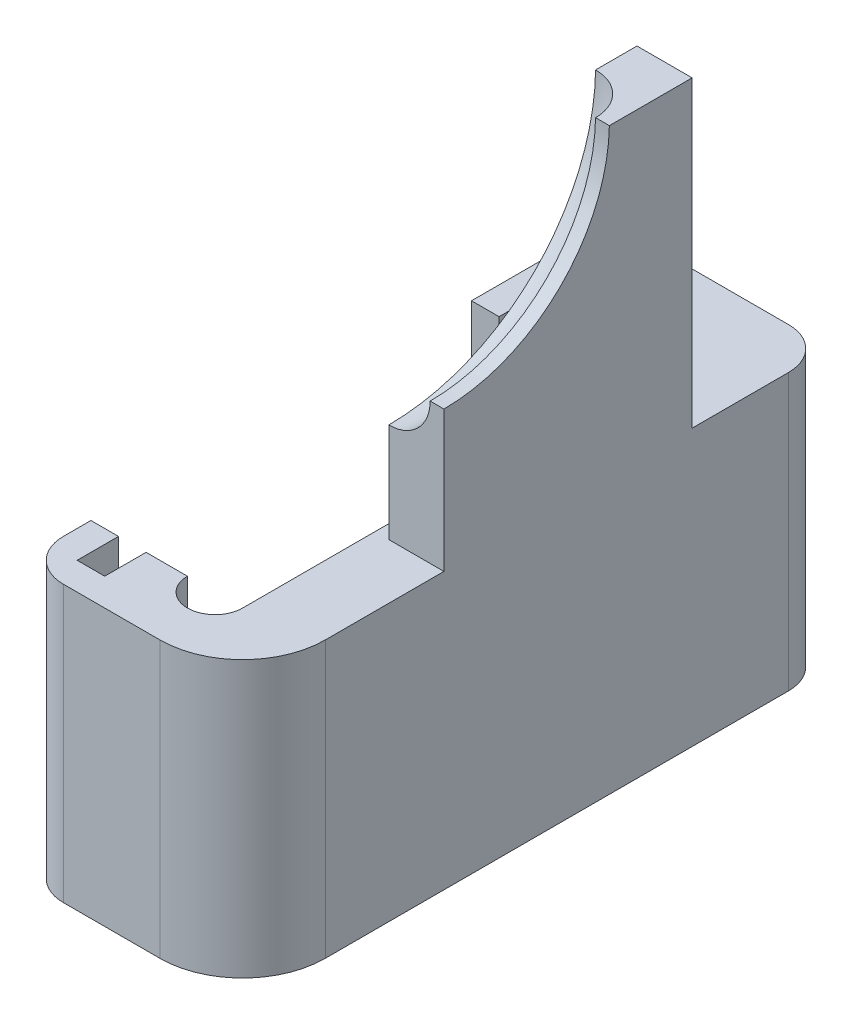
ISO-10303-21;
HEADER;
FILE_DESCRIPTION(('STEP AP214'),'2;1');
FILE_NAME('part.step','',(''),(''),'','','');
FILE_SCHEMA(('AUTOMOTIVE_DESIGN { 1 0 10303 214 1 1 1 1 }'));
ENDSEC;
DATA;
#1=APPLICATION_CONTEXT('core data for automotive mechanical design processes');
#2=APPLICATION_PROTOCOL_DEFINITION('international standard','automotive_design',2000,#1);
#3=PRODUCT_CONTEXT('',#1,'mechanical');
#4=PRODUCT('Part','Part','',(#3));
#5=PRODUCT_RELATED_PRODUCT_CATEGORY('part','',(#4));
#6=PRODUCT_DEFINITION_FORMATION('','',#4);
#7=PRODUCT_DEFINITION_CONTEXT('part definition',#1,'design');
#8=PRODUCT_DEFINITION('design','',#6,#7);
#9=PRODUCT_DEFINITION_SHAPE('','',#8);
#10=(LENGTH_UNIT() NAMED_UNIT(*) SI_UNIT(.MILLI.,.METRE.));
#11=(NAMED_UNIT(*) PLANE_ANGLE_UNIT() SI_UNIT($,.RADIAN.));
#12=(NAMED_UNIT(*) SI_UNIT($,.STERADIAN.) SOLID_ANGLE_UNIT());
#13=UNCERTAINTY_MEASURE_WITH_UNIT(LENGTH_MEASURE(1.E-05),#10,'distance_accuracy_value','');
#14=(GEOMETRIC_REPRESENTATION_CONTEXT(3) GLOBAL_UNCERTAINTY_ASSIGNED_CONTEXT((#13)) GLOBAL_UNIT_ASSIGNED_CONTEXT((#10,
#11,#12)) REPRESENTATION_CONTEXT('',''));
#15=CARTESIAN_POINT('',(0.,0.,0.));
#16=DIRECTION('',(0.,0.,1.));
#17=DIRECTION('',(1.,0.,0.));
#18=AXIS2_PLACEMENT_3D('',#15,#16,#17);
#19=CARTESIAN_POINT('',(0.,20.,0.));
#20=DIRECTION('',(1.,0.,0.));
#21=DIRECTION('',(0.,0.,-1.));
#22=AXIS2_PLACEMENT_3D('',#19,#20,#21);
#23=PLANE('',#22);
#24=DIRECTION('',(0.,0.,1.));
#25=VECTOR('',#24,1.);
#26=CARTESIAN_POINT('',(0.,20.,0.));
#27=LINE('',#26,#25);
#28=CARTESIAN_POINT('',(0.,20.,-15.3));
#29=VERTEX_POINT('',#28);
#30=CARTESIAN_POINT('',(0.,20.,12.3));
#31=VERTEX_POINT('',#30);
#32=EDGE_CURVE('E325',#29,#31,#27,.T.);
#33=ORIENTED_EDGE('',*,*,#32,.F.);
#34=DIRECTION('',(0.,-1.,0.));
#35=VECTOR('',#34,1.);
#36=CARTESIAN_POINT('',(0.,20.,-15.3));
#37=LINE('',#36,#35);
#38=CARTESIAN_POINT('',(0.,0.,-15.3));
#39=VERTEX_POINT('',#38);
#40=EDGE_CURVE('E349',#29,#39,#37,.T.);
#41=ORIENTED_EDGE('',*,*,#40,.T.);
#42=DIRECTION('',(0.,0.,1.));
#43=VECTOR('',#42,1.);
#44=CARTESIAN_POINT('',(0.,0.,0.));
#45=LINE('',#44,#43);
#46=CARTESIAN_POINT('',(0.,0.,12.3));
#47=VERTEX_POINT('',#46);
#48=EDGE_CURVE('E324',#39,#47,#45,.T.);
#49=ORIENTED_EDGE('',*,*,#48,.T.);
#50=DIRECTION('',(0.,-1.,0.));
#51=VECTOR('',#50,1.);
#52=CARTESIAN_POINT('',(0.,20.,12.3));
#53=LINE('',#52,#51);
#54=EDGE_CURVE('E383',#31,#47,#53,.T.);
#55=ORIENTED_EDGE('',*,*,#54,.F.);
#56=EDGE_LOOP('',(#33,#41,#49,#55));
#57=FACE_BOUND('',#56,.T.);
#58=ADVANCED_FACE('F41',(#57),#23,.F.);
#59=CARTESIAN_POINT('',(5.,42.,-15.3));
#60=DIRECTION('',(0.,-1.,0.));
#61=DIRECTION('',(0.,0.,-1.));
#62=AXIS2_PLACEMENT_3D('',#59,#60,#61);
#63=PLANE('',#62);
#64=DIRECTION('',(-1.,0.,0.));
#65=VECTOR('',#64,1.);
#66=CARTESIAN_POINT('',(5.,42.,-15.3));
#67=LINE('',#66,#65);
#68=CARTESIAN_POINT('',(5.,42.,-15.3));
#69=VERTEX_POINT('',#68);
#70=CARTESIAN_POINT('',(0.999999999999998,42.,-15.3));
#71=VERTEX_POINT('',#70);
#72=EDGE_CURVE('E249',#69,#71,#67,.T.);
#73=ORIENTED_EDGE('',*,*,#72,.T.);
#74=DIRECTION('',(0.,0.,1.));
#75=VECTOR('',#74,1.);
#76=CARTESIAN_POINT('',(0.999999999999998,42.,-15.3));
#77=LINE('',#76,#75);
#78=CARTESIAN_POINT('',(0.999999999999999,42.,-12.2986666074021));
#79=VERTEX_POINT('',#78);
#80=EDGE_CURVE('E241',#71,#79,#77,.T.);
#81=ORIENTED_EDGE('',*,*,#80,.T.);
#82=CARTESIAN_POINT('',(0.999999999999997,42.,-12.2986666074021));
#83=CARTESIAN_POINT('',(1.08437406161409,42.,-12.298674696237));
#84=CARTESIAN_POINT('',(1.1687442891838,42.,-12.2951068290857));
#85=CARTESIAN_POINT('',(1.33688105471364,42.,-12.2808817787849));
#86=CARTESIAN_POINT('',(1.42064762152304,42.,-12.270224936723));
#87=CARTESIAN_POINT('',(1.58692627032326,42.,-12.2418952560513));
#88=CARTESIAN_POINT('',(1.66943925458114,42.,-12.2242277385516));
#89=CARTESIAN_POINT('',(1.83266347257536,42.,-12.1820200727732));
#90=CARTESIAN_POINT('',(1.91337472824478,42.,-12.1574800082056));
#91=CARTESIAN_POINT('',(2.15202702606067,42.,-12.0737493886059));
#92=CARTESIAN_POINT('',(2.30655440963789,42.,-12.0044367926932));
#93=CARTESIAN_POINT('',(2.6016662265804,42.,-11.8408991894104));
#94=CARTESIAN_POINT('',(2.74225310214225,42.,-11.7466785562464));
#95=CARTESIAN_POINT('',(3.00564252906627,42.,-11.535965002824));
#96=CARTESIAN_POINT('',(3.12844464421391,42.,-11.4194715364326));
#97=CARTESIAN_POINT('',(3.35276870084162,42.,-11.1674980723235));
#98=CARTESIAN_POINT('',(3.45428647550261,42.,-11.0320143655469));
#99=CARTESIAN_POINT('',(3.63316182097115,42.,-10.7459021486977));
#100=CARTESIAN_POINT('',(3.71051259426008,42.,-10.5952693933312));
#101=CARTESIAN_POINT('',(3.83878988138071,42.,-10.2831864255121));
#102=CARTESIAN_POINT('',(3.88973181912892,42.,-10.1217425895643));
#103=CARTESIAN_POINT('',(3.9510993685279,42.,-9.8491494929645));
#104=CARTESIAN_POINT('',(3.96942610120558,42.,-9.73971364487767));
#105=CARTESIAN_POINT('',(3.99387482206519,42.,-9.51964486876867));
#106=CARTESIAN_POINT('',(4.00001411802277,42.,-9.40901386300275));
#107=CARTESIAN_POINT('',(4.,42.,-9.29833321757652));
#108=B_SPLINE_CURVE_WITH_KNOTS('',3,(#82,#83,#84,#85,#86,#87,#88,#89,#90,#91,#92,#93,#94,#95,
#96,#97,#98,#99,#100,#101,#102,#103,#104,#105,#106,#107),.UNSPECIFIED.,.F.,.F.,(4,2,2,2,2,2,2,2,
2,2,2,2,4),(0.,0.253039861257311,0.50606754832943,0.758903553333104,1.01173647879609,
1.51719853519627,2.02257188416038,2.52795762653786,3.03344221570318,3.53906885616965,
4.04439985489145,4.37664716212887,4.70842229564323),.UNSPECIFIED.);
#109=CARTESIAN_POINT('',(4.,42.,-9.29833321757652));
#110=VERTEX_POINT('',#109);
#111=EDGE_CURVE('E50',#79,#110,#108,.T.);
#112=ORIENTED_EDGE('',*,*,#111,.T.);
#113=DIRECTION('',(1.,0.,0.));
#114=VECTOR('',#113,1.);
#115=CARTESIAN_POINT('',(-98.1609010757338,42.,-9.2983332175765));
#116=LINE('',#115,#114);
#117=CARTESIAN_POINT('',(5.,42.,-9.29833321757652));
#118=VERTEX_POINT('',#117);
#119=EDGE_CURVE('E604',#110,#118,#116,.T.);
#120=ORIENTED_EDGE('',*,*,#119,.T.);
#121=DIRECTION('',(0.,0.,1.));
#122=VECTOR('',#121,1.);
#123=CARTESIAN_POINT('',(5.,42.,-15.3));
#124=LINE('',#123,#122);
#125=EDGE_CURVE('E595',#69,#118,#124,.T.);
#126=ORIENTED_EDGE('',*,*,#125,.F.);
#127=EDGE_LOOP('',(#73,#81,#112,#120,#126));
#128=FACE_BOUND('',#127,.T.);
#129=ADVANCED_FACE('F431',(#128),#63,.F.);
#130=CARTESIAN_POINT('',(5.,20.,2.7));
#131=DIRECTION('',(0.,0.,1.));
#132=DIRECTION('',(0.,-1.,0.));
#133=AXIS2_PLACEMENT_3D('',#130,#131,#132);
#134=PLANE('',#133);
#135=DIRECTION('',(0.,-1.,0.));
#136=VECTOR('',#135,1.);
#137=CARTESIAN_POINT('',(1.,42.,2.7));
#138=LINE('',#137,#136);
#139=CARTESIAN_POINT('',(0.999999999999999,27.2,2.7));
#140=VERTEX_POINT('',#139);
#141=CARTESIAN_POINT('',(1.,20.,2.7));
#142=VERTEX_POINT('',#141);
#143=EDGE_CURVE('E57',#140,#142,#138,.T.);
#144=ORIENTED_EDGE('',*,*,#143,.T.);
#145=DIRECTION('',(-1.,0.,0.));
#146=VECTOR('',#145,1.);
#147=CARTESIAN_POINT('',(5.,20.,2.7));
#148=LINE('',#147,#146);
#149=CARTESIAN_POINT('',(5.,20.,2.7));
#150=VERTEX_POINT('',#149);
#151=EDGE_CURVE('E235',#150,#142,#148,.T.);
#152=ORIENTED_EDGE('',*,*,#151,.F.);
#153=DIRECTION('',(0.,1.,0.));
#154=VECTOR('',#153,1.);
#155=CARTESIAN_POINT('',(5.,20.,2.7));
#156=LINE('',#155,#154);
#157=CARTESIAN_POINT('',(5.,30.2,2.7));
#158=VERTEX_POINT('',#157);
#159=EDGE_CURVE('E592',#150,#158,#156,.T.);
#160=ORIENTED_EDGE('',*,*,#159,.T.);
#161=DIRECTION('',(1.,0.,0.));
#162=VECTOR('',#161,1.);
#163=CARTESIAN_POINT('',(-98.1609010757338,30.2,2.70000000000001));
#164=LINE('',#163,#162);
#165=CARTESIAN_POINT('',(4.,30.2,2.7));
#166=VERTEX_POINT('',#165);
#167=EDGE_CURVE('E605',#166,#158,#164,.T.);
#168=ORIENTED_EDGE('',*,*,#167,.F.);
#169=CARTESIAN_POINT('',(0.999999999999999,30.2,2.7));
#170=DIRECTION('',(0.,0.,1.));
#171=DIRECTION('',(0.,-1.,0.));
#172=AXIS2_PLACEMENT_3D('',#169,#170,#171);
#173=CIRCLE('',#172,3.);
#174=EDGE_CURVE('E11',#166,#140,#173,.F.);
#175=ORIENTED_EDGE('',*,*,#174,.T.);
#176=EDGE_LOOP('',(#144,#152,#160,#168,#175));
#177=FACE_BOUND('',#176,.T.);
#178=ADVANCED_FACE('F436',(#177),#134,.T.);
#179=CARTESIAN_POINT('',(-11.,20.,-22.3));
#180=DIRECTION('',(0.,0.,-1.));
#181=DIRECTION('',(-1.,0.,0.));
#182=AXIS2_PLACEMENT_3D('',#179,#180,#181);
#183=PLANE('',#182);
#184=DIRECTION('',(0.,1.,0.));
#185=VECTOR('',#184,1.);
#186=CARTESIAN_POINT('',(-8.99999999999999,20.,-22.3));
#187=LINE('',#186,#185);
#188=CARTESIAN_POINT('',(-8.99999999999999,0.,-22.3));
#189=VERTEX_POINT('',#188);
#190=CARTESIAN_POINT('',(-8.99999999999999,20.,-22.3));
#191=VERTEX_POINT('',#190);
#192=EDGE_CURVE('E251',#189,#191,#187,.T.);
#193=ORIENTED_EDGE('',*,*,#192,.F.);
#194=DIRECTION('',(1.,0.,0.));
#195=VECTOR('',#194,1.);
#196=CARTESIAN_POINT('',(-11.,0.,-22.3));
#197=LINE('',#196,#195);
#198=CARTESIAN_POINT('',(-7.00000000000001,0.,-22.3));
#199=VERTEX_POINT('',#198);
#200=EDGE_CURVE('E289',#189,#199,#197,.T.);
#201=ORIENTED_EDGE('',*,*,#200,.T.);
#202=DIRECTION('',(0.,1.,0.));
#203=VECTOR('',#202,1.);
#204=CARTESIAN_POINT('',(-7.00000000000001,20.,-22.3));
#205=LINE('',#204,#203);
#206=CARTESIAN_POINT('',(-7.00000000000001,20.,-22.3));
#207=VERTEX_POINT('',#206);
#208=EDGE_CURVE('E294',#199,#207,#205,.T.);
#209=ORIENTED_EDGE('',*,*,#208,.T.);
#210=DIRECTION('',(1.,0.,0.));
#211=VECTOR('',#210,1.);
#212=CARTESIAN_POINT('',(-11.,20.,-22.3));
#213=LINE('',#212,#211);
#214=EDGE_CURVE('E291',#191,#207,#213,.T.);
#215=ORIENTED_EDGE('',*,*,#214,.F.);
#216=EDGE_LOOP('',(#193,#201,#209,#215));
#217=FACE_BOUND('',#216,.T.);
#218=ADVANCED_FACE('F461',(#217),#183,.F.);
#219=CARTESIAN_POINT('',(-11.,20.,15.3));
#220=DIRECTION('',(0.,0.,1.));
#221=DIRECTION('',(1.,0.,0.));
#222=AXIS2_PLACEMENT_3D('',#219,#220,#221);
#223=PLANE('',#222);
#224=DIRECTION('',(0.,-1.,0.));
#225=VECTOR('',#224,1.);
#226=CARTESIAN_POINT('',(-8.99999999999999,20.,15.3));
#227=LINE('',#226,#225);
#228=CARTESIAN_POINT('',(-8.99999999999999,20.,15.3));
#229=VERTEX_POINT('',#228);
#230=CARTESIAN_POINT('',(-9.,0.,15.3));
#231=VERTEX_POINT('',#230);
#232=EDGE_CURVE('E262',#229,#231,#227,.T.);
#233=ORIENTED_EDGE('',*,*,#232,.F.);
#234=DIRECTION('',(1.,0.,0.));
#235=VECTOR('',#234,1.);
#236=CARTESIAN_POINT('',(-11.,20.,15.3));
#237=LINE('',#236,#235);
#238=CARTESIAN_POINT('',(-7.,20.,15.3));
#239=VERTEX_POINT('',#238);
#240=EDGE_CURVE('E311',#229,#239,#237,.T.);
#241=ORIENTED_EDGE('',*,*,#240,.T.);
#242=DIRECTION('',(0.,-1.,0.));
#243=VECTOR('',#242,1.);
#244=CARTESIAN_POINT('',(-6.99999999999999,20.,15.3));
#245=LINE('',#244,#243);
#246=CARTESIAN_POINT('',(-7.,0.,15.3));
#247=VERTEX_POINT('',#246);
#248=EDGE_CURVE('E297',#239,#247,#245,.T.);
#249=ORIENTED_EDGE('',*,*,#248,.T.);
#250=DIRECTION('',(1.,0.,0.));
#251=VECTOR('',#250,1.);
#252=CARTESIAN_POINT('',(-11.,0.,15.3));
#253=LINE('',#252,#251);
#254=EDGE_CURVE('E307',#231,#247,#253,.T.);
#255=ORIENTED_EDGE('',*,*,#254,.F.);
#256=EDGE_LOOP('',(#233,#241,#249,#255));
#257=FACE_BOUND('',#256,.T.);
#258=ADVANCED_FACE('F464',(#257),#223,.F.);
#259=CARTESIAN_POINT('',(-7.,20.,0.));
#260=DIRECTION('',(-1.,0.,0.));
#261=DIRECTION('',(0.,0.,1.));
#262=AXIS2_PLACEMENT_3D('',#259,#260,#261);
#263=PLANE('',#262);
#264=DIRECTION('',(0.,0.,-1.));
#265=VECTOR('',#264,1.);
#266=CARTESIAN_POINT('',(-7.,20.,0.));
#267=LINE('',#266,#265);
#268=CARTESIAN_POINT('',(-7.,20.,-15.3));
#269=VERTEX_POINT('',#268);
#270=EDGE_CURVE('E340',#269,#207,#267,.T.);
#271=ORIENTED_EDGE('',*,*,#270,.T.);
#272=ORIENTED_EDGE('',*,*,#208,.F.);
#273=DIRECTION('',(0.,0.,-1.));
#274=VECTOR('',#273,1.);
#275=CARTESIAN_POINT('',(-7.,0.,0.));
#276=LINE('',#275,#274);
#277=CARTESIAN_POINT('',(-7.,0.,-15.3));
#278=VERTEX_POINT('',#277);
#279=EDGE_CURVE('E363',#278,#199,#276,.T.);
#280=ORIENTED_EDGE('',*,*,#279,.F.);
#281=DIRECTION('',(0.,-1.,0.));
#282=VECTOR('',#281,1.);
#283=CARTESIAN_POINT('',(-7.,20.,-15.3));
#284=LINE('',#283,#282);
#285=EDGE_CURVE('E374',#269,#278,#284,.T.);
#286=ORIENTED_EDGE('',*,*,#285,.F.);
#287=EDGE_LOOP('',(#271,#272,#280,#286));
#288=FACE_BOUND('',#287,.T.);
#289=ADVANCED_FACE('F476',(#288),#263,.T.);
#290=CARTESIAN_POINT('',(-7.,20.,0.));
#291=DIRECTION('',(1.,0.,0.));
#292=DIRECTION('',(0.,0.,-1.));
#293=AXIS2_PLACEMENT_3D('',#290,#291,#292);
#294=PLANE('',#293);
#295=ORIENTED_EDGE('',*,*,#248,.F.);
#296=DIRECTION('',(0.,0.,1.));
#297=VECTOR('',#296,1.);
#298=CARTESIAN_POINT('',(-7.,20.,0.));
#299=LINE('',#298,#297);
#300=CARTESIAN_POINT('',(-7.,20.,12.3));
#301=VERTEX_POINT('',#300);
#302=EDGE_CURVE('E332',#301,#239,#299,.T.);
#303=ORIENTED_EDGE('',*,*,#302,.F.);
#304=DIRECTION('',(0.,-1.,0.));
#305=VECTOR('',#304,1.);
#306=CARTESIAN_POINT('',(-7.,20.,12.3));
#307=LINE('',#306,#305);
#308=CARTESIAN_POINT('',(-7.,0.,12.3));
#309=VERTEX_POINT('',#308);
#310=EDGE_CURVE('E377',#301,#309,#307,.T.);
#311=ORIENTED_EDGE('',*,*,#310,.T.);
#312=DIRECTION('',(0.,0.,1.));
#313=VECTOR('',#312,1.);
#314=CARTESIAN_POINT('',(-7.,0.,0.));
#315=LINE('',#314,#313);
#316=EDGE_CURVE('E355',#309,#247,#315,.T.);
#317=ORIENTED_EDGE('',*,*,#316,.T.);
#318=EDGE_LOOP('',(#295,#303,#311,#317));
#319=FACE_BOUND('',#318,.T.);
#320=ADVANCED_FACE('F508',(#319),#294,.F.);
#321=CARTESIAN_POINT('',(-2.,20.,12.3));
#322=DIRECTION('',(0.,-1.,0.));
#323=DIRECTION('',(0.,0.,-1.));
#324=AXIS2_PLACEMENT_3D('',#321,#322,#323);
#325=CYLINDRICAL_SURFACE('',#324,2.);
#326=CARTESIAN_POINT('',(-2.,0.,12.3));
#327=DIRECTION('',(0.,1.,0.));
#328=DIRECTION('',(0.,0.,1.));
#329=AXIS2_PLACEMENT_3D('',#326,#327,#328);
#330=CIRCLE('',#329,2.);
#331=CARTESIAN_POINT('',(-4.,0.,12.3));
#332=VERTEX_POINT('',#331);
#333=EDGE_CURVE('E351',#47,#332,#330,.F.);
#334=ORIENTED_EDGE('',*,*,#333,.T.);
#335=DIRECTION('',(0.,-1.,0.));
#336=VECTOR('',#335,1.);
#337=CARTESIAN_POINT('',(-4.,20.,12.3));
#338=LINE('',#337,#336);
#339=CARTESIAN_POINT('',(-4.,20.,12.3));
#340=VERTEX_POINT('',#339);
#341=EDGE_CURVE('E380',#340,#332,#338,.T.);
#342=ORIENTED_EDGE('',*,*,#341,.F.);
#343=CARTESIAN_POINT('',(-2.,20.,12.3));
#344=DIRECTION('',(0.,1.,0.));
#345=DIRECTION('',(0.,0.,1.));
#346=AXIS2_PLACEMENT_3D('',#343,#344,#345);
#347=CIRCLE('',#346,2.);
#348=EDGE_CURVE('E327',#31,#340,#347,.F.);
#349=ORIENTED_EDGE('',*,*,#348,.F.);
#350=ORIENTED_EDGE('',*,*,#54,.T.);
#351=EDGE_LOOP('',(#334,#342,#349,#350));
#352=FACE_BOUND('',#351,.T.);
#353=ADVANCED_FACE('F519',(#352),#325,.F.);
#354=CARTESIAN_POINT('',(0.,20.,12.3));
#355=DIRECTION('',(0.,0.,1.));
#356=DIRECTION('',(1.,0.,0.));
#357=AXIS2_PLACEMENT_3D('',#354,#355,#356);
#358=PLANE('',#357);
#359=DIRECTION('',(-1.,0.,0.));
#360=VECTOR('',#359,1.);
#361=CARTESIAN_POINT('',(0.,0.,12.3));
#362=LINE('',#361,#360);
#363=EDGE_CURVE('E353',#332,#309,#362,.T.);
#364=ORIENTED_EDGE('',*,*,#363,.T.);
#365=ORIENTED_EDGE('',*,*,#310,.F.);
#366=DIRECTION('',(-1.,0.,0.));
#367=VECTOR('',#366,1.);
#368=CARTESIAN_POINT('',(0.,20.,12.3));
#369=LINE('',#368,#367);
#370=EDGE_CURVE('E330',#340,#301,#369,.T.);
#371=ORIENTED_EDGE('',*,*,#370,.F.);
#372=ORIENTED_EDGE('',*,*,#341,.T.);
#373=EDGE_LOOP('',(#364,#365,#371,#372));
#374=FACE_BOUND('',#373,.T.);
#375=ADVANCED_FACE('F515',(#374),#358,.F.);
#376=CARTESIAN_POINT('',(0.,20.,17.3));
#377=DIRECTION('',(0.,0.,-1.));
#378=DIRECTION('',(-1.,0.,0.));
#379=AXIS2_PLACEMENT_3D('',#376,#377,#378);
#380=PLANE('',#379);
#381=DIRECTION('',(1.,0.,0.));
#382=VECTOR('',#381,1.);
#383=CARTESIAN_POINT('',(0.,20.,17.3));
#384=LINE('',#383,#382);
#385=CARTESIAN_POINT('',(-7.99999999999999,20.,17.3));
#386=VERTEX_POINT('',#385);
#387=CARTESIAN_POINT('',(-0.999999999999993,20.,17.3));
#388=VERTEX_POINT('',#387);
#389=EDGE_CURVE('E335',#386,#388,#384,.T.);
#390=ORIENTED_EDGE('',*,*,#389,.F.);
#391=DIRECTION('',(0.,1.,0.));
#392=VECTOR('',#391,1.);
#393=CARTESIAN_POINT('',(-7.99999999999999,20.,17.3));
#394=LINE('',#393,#392);
#395=CARTESIAN_POINT('',(-7.99999999999999,0.,17.3));
#396=VERTEX_POINT('',#395);
#397=EDGE_CURVE('E414',#386,#396,#394,.F.);
#398=ORIENTED_EDGE('',*,*,#397,.T.);
#399=DIRECTION('',(1.,0.,0.));
#400=VECTOR('',#399,1.);
#401=CARTESIAN_POINT('',(0.,0.,17.3));
#402=LINE('',#401,#400);
#403=CARTESIAN_POINT('',(-0.999999999999993,0.,17.3));
#404=VERTEX_POINT('',#403);
#405=EDGE_CURVE('E358',#396,#404,#402,.T.);
#406=ORIENTED_EDGE('',*,*,#405,.T.);
#407=DIRECTION('',(0.,-1.,0.));
#408=VECTOR('',#407,1.);
#409=CARTESIAN_POINT('',(-0.999999999999993,20.,17.3));
#410=LINE('',#409,#408);
#411=EDGE_CURVE('E391',#404,#388,#410,.F.);
#412=ORIENTED_EDGE('',*,*,#411,.T.);
#413=EDGE_LOOP('',(#390,#398,#406,#412));
#414=FACE_BOUND('',#413,.T.);
#415=ADVANCED_FACE('F512',(#414),#380,.F.);
#416=CARTESIAN_POINT('',(5.,20.,0.));
#417=DIRECTION('',(1.,0.,0.));
#418=DIRECTION('',(0.,0.,-1.));
#419=AXIS2_PLACEMENT_3D('',#416,#417,#418);
#420=PLANE('',#419);
#421=DIRECTION('',(0.,-1.,0.));
#422=VECTOR('',#421,1.);
#423=CARTESIAN_POINT('',(5.,0.,11.3));
#424=LINE('',#423,#422);
#425=CARTESIAN_POINT('',(5.,20.,11.3));
#426=VERTEX_POINT('',#425);
#427=CARTESIAN_POINT('',(5.,0.,11.3));
#428=VERTEX_POINT('',#427);
#429=EDGE_CURVE('E386',#426,#428,#424,.T.);
#430=ORIENTED_EDGE('',*,*,#429,.T.);
#431=DIRECTION('',(0.,0.,1.));
#432=VECTOR('',#431,1.);
#433=CARTESIAN_POINT('',(5.,0.,0.));
#434=LINE('',#433,#432);
#435=CARTESIAN_POINT('',(5.,0.,-22.3));
#436=VERTEX_POINT('',#435);
#437=EDGE_CURVE('E361',#436,#428,#434,.T.);
#438=ORIENTED_EDGE('',*,*,#437,.F.);
#439=DIRECTION('',(0.,-1.,0.));
#440=VECTOR('',#439,1.);
#441=CARTESIAN_POINT('',(5.,20.,-22.3));
#442=LINE('',#441,#440);
#443=CARTESIAN_POINT('',(5.,20.,-22.3));
#444=VERTEX_POINT('',#443);
#445=EDGE_CURVE('E402',#436,#444,#442,.F.);
#446=ORIENTED_EDGE('',*,*,#445,.T.);
#447=DIRECTION('',(0.,0.,1.));
#448=VECTOR('',#447,1.);
#449=CARTESIAN_POINT('',(5.,20.,0.));
#450=LINE('',#449,#448);
#451=CARTESIAN_POINT('',(5.,20.,-15.3));
#452=VERTEX_POINT('',#451);
#453=EDGE_CURVE('E338',#444,#452,#450,.T.);
#454=ORIENTED_EDGE('',*,*,#453,.T.);
#455=DIRECTION('',(0.,1.,0.));
#456=VECTOR('',#455,1.);
#457=CARTESIAN_POINT('',(5.,20.,-15.3));
#458=LINE('',#457,#456);
#459=EDGE_CURVE('E247',#452,#69,#458,.T.);
#460=ORIENTED_EDGE('',*,*,#459,.T.);
#461=ORIENTED_EDGE('',*,*,#125,.T.);
#462=CARTESIAN_POINT('',(5.,42.2,2.7));
#463=DIRECTION('',(1.,0.,0.));
#464=DIRECTION('',(0.,0.,-1.));
#465=AXIS2_PLACEMENT_3D('',#462,#463,#464);
#466=CIRCLE('',#465,12.);
#467=EDGE_CURVE('E64',#158,#118,#466,.T.);
#468=ORIENTED_EDGE('',*,*,#467,.F.);
#469=ORIENTED_EDGE('',*,*,#159,.F.);
#470=EDGE_CURVE('E337',#150,#426,#450,.T.);
#471=ORIENTED_EDGE('',*,*,#470,.T.);
#472=EDGE_LOOP('',(#430,#438,#446,#454,#460,#461,#468,#469,#471));
#473=FACE_BOUND('',#472,.T.);
#474=ADVANCED_FACE('F504',(#473),#420,.T.);
#475=CARTESIAN_POINT('',(0.,20.,-15.3));
#476=DIRECTION('',(0.,0.,1.));
#477=DIRECTION('',(1.,0.,0.));
#478=AXIS2_PLACEMENT_3D('',#475,#476,#477);
#479=PLANE('',#478);
#480=DIRECTION('',(-1.,0.,0.));
#481=VECTOR('',#480,1.);
#482=CARTESIAN_POINT('',(0.,0.,-15.3));
#483=LINE('',#482,#481);
#484=CARTESIAN_POINT('',(-4.,0.,-15.3));
#485=VERTEX_POINT('',#484);
#486=EDGE_CURVE('E366',#485,#278,#483,.T.);
#487=ORIENTED_EDGE('',*,*,#486,.F.);
#488=DIRECTION('',(0.,-1.,0.));
#489=VECTOR('',#488,1.);
#490=CARTESIAN_POINT('',(-4.,20.,-15.3));
#491=LINE('',#490,#489);
#492=CARTESIAN_POINT('',(-4.,20.,-15.3));
#493=VERTEX_POINT('',#492);
#494=EDGE_CURVE('E372',#493,#485,#491,.T.);
#495=ORIENTED_EDGE('',*,*,#494,.F.);
#496=DIRECTION('',(-1.,0.,0.));
#497=VECTOR('',#496,1.);
#498=CARTESIAN_POINT('',(0.,20.,-15.3));
#499=LINE('',#498,#497);
#500=EDGE_CURVE('E343',#493,#269,#499,.T.);
#501=ORIENTED_EDGE('',*,*,#500,.T.);
#502=ORIENTED_EDGE('',*,*,#285,.T.);
#503=EDGE_LOOP('',(#487,#495,#501,#502));
#504=FACE_BOUND('',#503,.T.);
#505=ADVANCED_FACE('F500',(#504),#479,.T.);
#506=CARTESIAN_POINT('',(-2.,20.,-15.3));
#507=DIRECTION('',(0.,-1.,0.));
#508=DIRECTION('',(0.,0.,-1.));
#509=AXIS2_PLACEMENT_3D('',#506,#507,#508);
#510=CYLINDRICAL_SURFACE('',#509,2.);
#511=CARTESIAN_POINT('',(-2.,0.,-15.3));
#512=DIRECTION('',(0.,1.,0.));
#513=DIRECTION('',(0.,0.,1.));
#514=AXIS2_PLACEMENT_3D('',#511,#512,#513);
#515=CIRCLE('',#514,2.);
#516=EDGE_CURVE('E328',#485,#39,#515,.F.);
#517=ORIENTED_EDGE('',*,*,#516,.T.);
#518=ORIENTED_EDGE('',*,*,#40,.F.);
#519=CARTESIAN_POINT('',(-2.,20.,-15.3));
#520=DIRECTION('',(0.,1.,0.));
#521=DIRECTION('',(0.,0.,1.));
#522=AXIS2_PLACEMENT_3D('',#519,#520,#521);
#523=CIRCLE('',#522,2.);
#524=EDGE_CURVE('E346',#493,#29,#523,.F.);
#525=ORIENTED_EDGE('',*,*,#524,.F.);
#526=ORIENTED_EDGE('',*,*,#494,.T.);
#527=EDGE_LOOP('',(#517,#518,#525,#526));
#528=FACE_BOUND('',#527,.T.);
#529=ADVANCED_FACE('F494',(#528),#510,.F.);
#530=CARTESIAN_POINT('',(0.,20.,0.));
#531=DIRECTION('',(0.,1.,0.));
#532=DIRECTION('',(0.,0.,1.));
#533=AXIS2_PLACEMENT_3D('',#530,#531,#532);
#534=PLANE('',#533);
#535=DIRECTION('',(-1.,0.,0.));
#536=VECTOR('',#535,1.);
#537=CARTESIAN_POINT('',(5.,20.,-15.3));
#538=LINE('',#537,#536);
#539=CARTESIAN_POINT('',(0.999999999999998,20.,-15.3));
#540=VERTEX_POINT('',#539);
#541=EDGE_CURVE('E232',#452,#540,#538,.T.);
#542=ORIENTED_EDGE('',*,*,#541,.F.);
#543=ORIENTED_EDGE('',*,*,#453,.F.);
#544=CARTESIAN_POINT('',(2.,20.,-22.3));
#545=DIRECTION('',(0.,1.,0.));
#546=DIRECTION('',(0.,0.,1.));
#547=AXIS2_PLACEMENT_3D('',#544,#545,#546);
#548=CIRCLE('',#547,3.);
#549=CARTESIAN_POINT('',(2.,20.,-25.3));
#550=VERTEX_POINT('',#549);
#551=EDGE_CURVE('E404',#444,#550,#548,.T.);
#552=ORIENTED_EDGE('',*,*,#551,.T.);
#553=DIRECTION('',(1.,0.,0.));
#554=VECTOR('',#553,1.);
#555=CARTESIAN_POINT('',(5.,20.,-25.3));
#556=LINE('',#555,#554);
#557=CARTESIAN_POINT('',(-8.00000000000001,20.,-25.3));
#558=VERTEX_POINT('',#557);
#559=EDGE_CURVE('E322',#558,#550,#556,.T.);
#560=ORIENTED_EDGE('',*,*,#559,.F.);
#561=CARTESIAN_POINT('',(-8.00000000000001,20.,-22.3));
#562=DIRECTION('',(0.,1.,0.));
#563=DIRECTION('',(0.,0.,1.));
#564=AXIS2_PLACEMENT_3D('',#561,#562,#563);
#565=CIRCLE('',#564,3.);
#566=CARTESIAN_POINT('',(-11.,20.,-22.3));
#567=VERTEX_POINT('',#566);
#568=EDGE_CURVE('E410',#558,#567,#565,.T.);
#569=ORIENTED_EDGE('',*,*,#568,.T.);
#570=DIRECTION('',(0.,0.,-1.));
#571=VECTOR('',#570,1.);
#572=CARTESIAN_POINT('',(-11.,20.,-25.3));
#573=LINE('',#572,#571);
#574=CARTESIAN_POINT('',(-11.,20.,-15.3));
#575=VERTEX_POINT('',#574);
#576=EDGE_CURVE('E293',#575,#567,#573,.T.);
#577=ORIENTED_EDGE('',*,*,#576,.F.);
#578=DIRECTION('',(-1.,0.,0.));
#579=VECTOR('',#578,1.);
#580=CARTESIAN_POINT('',(-11.,20.,-15.3));
#581=LINE('',#580,#579);
#582=CARTESIAN_POINT('',(-8.99999999999999,20.,-15.3));
#583=VERTEX_POINT('',#582);
#584=EDGE_CURVE('E269',#583,#575,#581,.T.);
#585=ORIENTED_EDGE('',*,*,#584,.F.);
#586=DIRECTION('',(0.,0.,-1.));
#587=VECTOR('',#586,1.);
#588=CARTESIAN_POINT('',(-8.99999999999999,20.,4.79975124224178));
#589=LINE('',#588,#587);
#590=EDGE_CURVE('E258',#583,#191,#589,.T.);
#591=ORIENTED_EDGE('',*,*,#590,.T.);
#592=ORIENTED_EDGE('',*,*,#214,.T.);
#593=ORIENTED_EDGE('',*,*,#270,.F.);
#594=ORIENTED_EDGE('',*,*,#500,.F.);
#595=ORIENTED_EDGE('',*,*,#524,.T.);
#596=ORIENTED_EDGE('',*,*,#32,.T.);
#597=ORIENTED_EDGE('',*,*,#348,.T.);
#598=ORIENTED_EDGE('',*,*,#370,.T.);
#599=ORIENTED_EDGE('',*,*,#302,.T.);
#600=ORIENTED_EDGE('',*,*,#240,.F.);
#601=DIRECTION('',(0.,0.,1.));
#602=VECTOR('',#601,1.);
#603=CARTESIAN_POINT('',(-9.,20.,12.3));
#604=LINE('',#603,#602);
#605=CARTESIAN_POINT('',(-9.,20.,12.3));
#606=VERTEX_POINT('',#605);
#607=EDGE_CURVE('E287',#606,#229,#604,.T.);
#608=ORIENTED_EDGE('',*,*,#607,.F.);
#609=DIRECTION('',(1.,0.,0.));
#610=VECTOR('',#609,1.);
#611=CARTESIAN_POINT('',(-11.,20.,12.3));
#612=LINE('',#611,#610);
#613=CARTESIAN_POINT('',(-11.,20.,12.3));
#614=VERTEX_POINT('',#613);
#615=EDGE_CURVE('E276',#614,#606,#612,.T.);
#616=ORIENTED_EDGE('',*,*,#615,.F.);
#617=DIRECTION('',(0.,0.,-1.));
#618=VECTOR('',#617,1.);
#619=CARTESIAN_POINT('',(-11.,20.,17.3));
#620=LINE('',#619,#618);
#621=CARTESIAN_POINT('',(-11.,20.,14.3));
#622=VERTEX_POINT('',#621);
#623=EDGE_CURVE('E302',#622,#614,#620,.T.);
#624=ORIENTED_EDGE('',*,*,#623,.F.);
#625=CARTESIAN_POINT('',(-7.99999999999999,20.,14.3));
#626=DIRECTION('',(0.,1.,0.));
#627=DIRECTION('',(0.,0.,1.));
#628=AXIS2_PLACEMENT_3D('',#625,#626,#627);
#629=CIRCLE('',#628,3.);
#630=EDGE_CURVE('E412',#622,#386,#629,.T.);
#631=ORIENTED_EDGE('',*,*,#630,.T.);
#632=ORIENTED_EDGE('',*,*,#389,.T.);
#633=CARTESIAN_POINT('',(-0.999999999999997,20.,11.3));
#634=DIRECTION('',(0.,1.,0.));
#635=DIRECTION('',(0.,0.,1.));
#636=AXIS2_PLACEMENT_3D('',#633,#634,#635);
#637=CIRCLE('',#636,6.);
#638=EDGE_CURVE('E394',#388,#426,#637,.T.);
#639=ORIENTED_EDGE('',*,*,#638,.T.);
#640=ORIENTED_EDGE('',*,*,#470,.F.);
#641=ORIENTED_EDGE('',*,*,#151,.T.);
#642=DIRECTION('',(0.,0.,-1.));
#643=VECTOR('',#642,1.);
#644=CARTESIAN_POINT('',(0.999999999999998,20.,-15.3));
#645=LINE('',#644,#643);
#646=EDGE_CURVE('E227',#142,#540,#645,.T.);
#647=ORIENTED_EDGE('',*,*,#646,.T.);
#648=EDGE_LOOP('',(#542,#543,#552,#560,#569,#577,#585,#591,#592,#593,#594,#595,#596,#597,#598,
#599,#600,#608,#616,#624,#631,#632,#639,#640,#641,#647));
#649=FACE_BOUND('',#648,.T.);
#650=ADVANCED_FACE('F229',(#649),#534,.T.);
#651=CARTESIAN_POINT('',(0.,0.,0.));
#652=DIRECTION('',(0.,1.,0.));
#653=DIRECTION('',(0.,0.,1.));
#654=AXIS2_PLACEMENT_3D('',#651,#652,#653);
#655=PLANE('',#654);
#656=ORIENTED_EDGE('',*,*,#486,.T.);
#657=ORIENTED_EDGE('',*,*,#279,.T.);
#658=ORIENTED_EDGE('',*,*,#200,.F.);
#659=DIRECTION('',(0.,0.,-1.));
#660=VECTOR('',#659,1.);
#661=CARTESIAN_POINT('',(-8.99999999999999,0.,4.79975124224178));
#662=LINE('',#661,#660);
#663=CARTESIAN_POINT('',(-8.99999999999999,0.,-15.3));
#664=VERTEX_POINT('',#663);
#665=EDGE_CURVE('E248',#664,#189,#662,.T.);
#666=ORIENTED_EDGE('',*,*,#665,.F.);
#667=DIRECTION('',(1.,0.,0.));
#668=VECTOR('',#667,1.);
#669=CARTESIAN_POINT('',(-11.,0.,-15.3));
#670=LINE('',#669,#668);
#671=CARTESIAN_POINT('',(-11.,0.,-15.3));
#672=VERTEX_POINT('',#671);
#673=EDGE_CURVE('E263',#672,#664,#670,.T.);
#674=ORIENTED_EDGE('',*,*,#673,.F.);
#675=DIRECTION('',(0.,0.,1.));
#676=VECTOR('',#675,1.);
#677=CARTESIAN_POINT('',(-11.,0.,-25.3));
#678=LINE('',#677,#676);
#679=CARTESIAN_POINT('',(-11.,0.,-22.3));
#680=VERTEX_POINT('',#679);
#681=EDGE_CURVE('E298',#680,#672,#678,.T.);
#682=ORIENTED_EDGE('',*,*,#681,.F.);
#683=CARTESIAN_POINT('',(-8.00000000000001,0.,-22.3));
#684=DIRECTION('',(0.,1.,0.));
#685=DIRECTION('',(0.,0.,1.));
#686=AXIS2_PLACEMENT_3D('',#683,#684,#685);
#687=CIRCLE('',#686,3.);
#688=CARTESIAN_POINT('',(-8.00000000000001,0.,-25.3));
#689=VERTEX_POINT('',#688);
#690=EDGE_CURVE('E416',#680,#689,#687,.F.);
#691=ORIENTED_EDGE('',*,*,#690,.T.);
#692=DIRECTION('',(-1.,0.,0.));
#693=VECTOR('',#692,1.);
#694=CARTESIAN_POINT('',(5.,0.,-25.3));
#695=LINE('',#694,#693);
#696=CARTESIAN_POINT('',(2.,0.,-25.3));
#697=VERTEX_POINT('',#696);
#698=EDGE_CURVE('E317',#697,#689,#695,.T.);
#699=ORIENTED_EDGE('',*,*,#698,.F.);
#700=CARTESIAN_POINT('',(2.,0.,-22.3));
#701=DIRECTION('',(0.,1.,0.));
#702=DIRECTION('',(0.,0.,1.));
#703=AXIS2_PLACEMENT_3D('',#700,#701,#702);
#704=CIRCLE('',#703,3.);
#705=EDGE_CURVE('E400',#697,#436,#704,.F.);
#706=ORIENTED_EDGE('',*,*,#705,.T.);
#707=ORIENTED_EDGE('',*,*,#437,.T.);
#708=CARTESIAN_POINT('',(-0.999999999999997,0.,11.3));
#709=DIRECTION('',(0.,1.,0.));
#710=DIRECTION('',(0.,0.,1.));
#711=AXIS2_PLACEMENT_3D('',#708,#709,#710);
#712=CIRCLE('',#711,6.);
#713=EDGE_CURVE('E389',#428,#404,#712,.F.);
#714=ORIENTED_EDGE('',*,*,#713,.T.);
#715=ORIENTED_EDGE('',*,*,#405,.F.);
#716=CARTESIAN_POINT('',(-7.99999999999999,0.,14.3));
#717=DIRECTION('',(0.,1.,0.));
#718=DIRECTION('',(0.,0.,1.));
#719=AXIS2_PLACEMENT_3D('',#716,#717,#718);
#720=CIRCLE('',#719,3.);
#721=CARTESIAN_POINT('',(-11.,0.,14.3));
#722=VERTEX_POINT('',#721);
#723=EDGE_CURVE('E418',#396,#722,#720,.F.);
#724=ORIENTED_EDGE('',*,*,#723,.T.);
#725=DIRECTION('',(0.,0.,1.));
#726=VECTOR('',#725,1.);
#727=CARTESIAN_POINT('',(-11.,0.,17.3));
#728=LINE('',#727,#726);
#729=CARTESIAN_POINT('',(-11.,0.,12.3));
#730=VERTEX_POINT('',#729);
#731=EDGE_CURVE('E304',#730,#722,#728,.T.);
#732=ORIENTED_EDGE('',*,*,#731,.F.);
#733=DIRECTION('',(-1.,0.,0.));
#734=VECTOR('',#733,1.);
#735=CARTESIAN_POINT('',(-11.,0.,12.3));
#736=LINE('',#735,#734);
#737=CARTESIAN_POINT('',(-9.,0.,12.3));
#738=VERTEX_POINT('',#737);
#739=EDGE_CURVE('E280',#738,#730,#736,.T.);
#740=ORIENTED_EDGE('',*,*,#739,.F.);
#741=DIRECTION('',(0.,0.,1.));
#742=VECTOR('',#741,1.);
#743=CARTESIAN_POINT('',(-9.,0.,12.3));
#744=LINE('',#743,#742);
#745=EDGE_CURVE('E283',#738,#231,#744,.T.);
#746=ORIENTED_EDGE('',*,*,#745,.T.);
#747=ORIENTED_EDGE('',*,*,#254,.T.);
#748=ORIENTED_EDGE('',*,*,#316,.F.);
#749=ORIENTED_EDGE('',*,*,#363,.F.);
#750=ORIENTED_EDGE('',*,*,#333,.F.);
#751=ORIENTED_EDGE('',*,*,#48,.F.);
#752=ORIENTED_EDGE('',*,*,#516,.F.);
#753=EDGE_LOOP('',(#656,#657,#658,#666,#674,#682,#691,#699,#706,#707,#714,#715,#724,#732,#740,
#746,#747,#748,#749,#750,#751,#752));
#754=FACE_BOUND('',#753,.T.);
#755=ADVANCED_FACE('F490',(#754),#655,.F.);
#756=CARTESIAN_POINT('',(0.,0.,-25.3));
#757=DIRECTION('',(0.,0.,-1.));
#758=DIRECTION('',(-1.,0.,0.));
#759=AXIS2_PLACEMENT_3D('',#756,#757,#758);
#760=PLANE('',#759);
#761=CARTESIAN_POINT('',(-0.500000000000001,10.,-25.3));
#762=DIRECTION('',(0.,0.,-1.));
#763=DIRECTION('',(-1.,0.,0.));
#764=AXIS2_PLACEMENT_3D('',#761,#762,#763);
#765=CIRCLE('',#764,2.);
#766=CARTESIAN_POINT('',(-2.5,10.,-25.3));
#767=VERTEX_POINT('',#766);
#768=EDGE_CURVE('E313',#767,#767,#765,.T.);
#769=ORIENTED_EDGE('',*,*,#768,.F.);
#770=EDGE_LOOP('',(#769));
#771=FACE_BOUND('',#770,.T.);
#772=ORIENTED_EDGE('',*,*,#698,.T.);
#773=DIRECTION('',(0.,-1.,0.));
#774=VECTOR('',#773,1.);
#775=CARTESIAN_POINT('',(-8.00000000000001,0.,-25.3));
#776=LINE('',#775,#774);
#777=EDGE_CURVE('E423',#689,#558,#776,.F.);
#778=ORIENTED_EDGE('',*,*,#777,.T.);
#779=ORIENTED_EDGE('',*,*,#559,.T.);
#780=DIRECTION('',(0.,-1.,0.));
#781=VECTOR('',#780,1.);
#782=CARTESIAN_POINT('',(2.,0.,-25.3));
#783=LINE('',#782,#781);
#784=EDGE_CURVE('E397',#550,#697,#783,.T.);
#785=ORIENTED_EDGE('',*,*,#784,.T.);
#786=EDGE_LOOP('',(#772,#778,#779,#785));
#787=FACE_BOUND('',#786,.T.);
#788=ADVANCED_FACE('F486',(#771,#787),#760,.T.);
#789=CARTESIAN_POINT('',(-0.999999999999997,20.,11.3));
#790=DIRECTION('',(0.,1.,0.));
#791=DIRECTION('',(0.,0.,1.));
#792=AXIS2_PLACEMENT_3D('',#789,#790,#791);
#793=CYLINDRICAL_SURFACE('',#792,6.);
#794=ORIENTED_EDGE('',*,*,#638,.F.);
#795=ORIENTED_EDGE('',*,*,#411,.F.);
#796=ORIENTED_EDGE('',*,*,#713,.F.);
#797=ORIENTED_EDGE('',*,*,#429,.F.);
#798=EDGE_LOOP('',(#794,#795,#796,#797));
#799=FACE_BOUND('',#798,.T.);
#800=ADVANCED_FACE('F489',(#799),#793,.T.);
#801=CARTESIAN_POINT('',(2.,0.,-22.3));
#802=DIRECTION('',(0.,-1.,0.));
#803=DIRECTION('',(0.,0.,-1.));
#804=AXIS2_PLACEMENT_3D('',#801,#802,#803);
#805=CYLINDRICAL_SURFACE('',#804,3.);
#806=ORIENTED_EDGE('',*,*,#551,.F.);
#807=ORIENTED_EDGE('',*,*,#445,.F.);
#808=ORIENTED_EDGE('',*,*,#705,.F.);
#809=ORIENTED_EDGE('',*,*,#784,.F.);
#810=EDGE_LOOP('',(#806,#807,#808,#809));
#811=FACE_BOUND('',#810,.T.);
#812=ADVANCED_FACE('F484',(#811),#805,.T.);
#813=CARTESIAN_POINT('',(-0.499999999999999,10.,-19.3));
#814=DIRECTION('',(0.,0.,-1.));
#815=DIRECTION('',(-1.,0.,0.));
#816=AXIS2_PLACEMENT_3D('',#813,#814,#815);
#817=CYLINDRICAL_SURFACE('',#816,2.);
#818=CARTESIAN_POINT('',(-0.499999999999999,10.,-19.3));
#819=DIRECTION('',(0.,0.,-1.));
#820=DIRECTION('',(-1.,0.,0.));
#821=AXIS2_PLACEMENT_3D('',#818,#819,#820);
#822=CIRCLE('',#821,2.);
#823=CARTESIAN_POINT('',(-2.5,10.,-19.3));
#824=VERTEX_POINT('',#823);
#825=EDGE_CURVE('E314',#824,#824,#822,.T.);
#826=ORIENTED_EDGE('',*,*,#825,.F.);
#827=EDGE_LOOP('',(#826));
#828=FACE_BOUND('',#827,.T.);
#829=ORIENTED_EDGE('',*,*,#768,.T.);
#830=EDGE_LOOP('',(#829));
#831=FACE_BOUND('',#830,.T.);
#832=ADVANCED_FACE('F480',(#828,#831),#817,.F.);
#833=CARTESIAN_POINT('',(-0.499999999999999,10.,-19.3));
#834=DIRECTION('',(0.,0.,-1.));
#835=DIRECTION('',(-1.,0.,0.));
#836=AXIS2_PLACEMENT_3D('',#833,#834,#835);
#837=PLANE('',#836);
#838=ORIENTED_EDGE('',*,*,#825,.T.);
#839=EDGE_LOOP('',(#838));
#840=FACE_BOUND('',#839,.T.);
#841=ADVANCED_FACE('F472',(#840),#837,.T.);
#842=CARTESIAN_POINT('',(-11.,0.,0.));
#843=DIRECTION('',(1.,0.,0.));
#844=DIRECTION('',(0.,0.,-1.));
#845=AXIS2_PLACEMENT_3D('',#842,#843,#844);
#846=PLANE('',#845);
#847=ORIENTED_EDGE('',*,*,#731,.T.);
#848=DIRECTION('',(0.,1.,0.));
#849=VECTOR('',#848,1.);
#850=CARTESIAN_POINT('',(-11.,0.,14.3));
#851=LINE('',#850,#849);
#852=EDGE_CURVE('E407',#722,#622,#851,.T.);
#853=ORIENTED_EDGE('',*,*,#852,.T.);
#854=ORIENTED_EDGE('',*,*,#623,.T.);
#855=DIRECTION('',(0.,1.,0.));
#856=VECTOR('',#855,1.);
#857=CARTESIAN_POINT('',(-11.,20.,12.3));
#858=LINE('',#857,#856);
#859=EDGE_CURVE('E273',#730,#614,#858,.T.);
#860=ORIENTED_EDGE('',*,*,#859,.F.);
#861=EDGE_LOOP('',(#847,#853,#854,#860));
#862=FACE_BOUND('',#861,.T.);
#863=ADVANCED_FACE('F468',(#862),#846,.F.);
#864=CARTESIAN_POINT('',(-11.,0.,0.));
#865=DIRECTION('',(-1.,0.,0.));
#866=DIRECTION('',(0.,0.,1.));
#867=AXIS2_PLACEMENT_3D('',#864,#865,#866);
#868=PLANE('',#867);
#869=ORIENTED_EDGE('',*,*,#576,.T.);
#870=DIRECTION('',(0.,-1.,0.));
#871=VECTOR('',#870,1.);
#872=CARTESIAN_POINT('',(-11.,0.,-22.3));
#873=LINE('',#872,#871);
#874=EDGE_CURVE('E420',#567,#680,#873,.T.);
#875=ORIENTED_EDGE('',*,*,#874,.T.);
#876=ORIENTED_EDGE('',*,*,#681,.T.);
#877=DIRECTION('',(0.,-1.,0.));
#878=VECTOR('',#877,1.);
#879=CARTESIAN_POINT('',(-11.,20.,-15.3));
#880=LINE('',#879,#878);
#881=EDGE_CURVE('E266',#575,#672,#880,.T.);
#882=ORIENTED_EDGE('',*,*,#881,.F.);
#883=EDGE_LOOP('',(#869,#875,#876,#882));
#884=FACE_BOUND('',#883,.T.);
#885=ADVANCED_FACE('F459',(#884),#868,.T.);
#886=CARTESIAN_POINT('',(-9.,20.,12.3));
#887=DIRECTION('',(-1.,0.,0.));
#888=DIRECTION('',(0.,0.,1.));
#889=AXIS2_PLACEMENT_3D('',#886,#887,#888);
#890=PLANE('',#889);
#891=ORIENTED_EDGE('',*,*,#232,.T.);
#892=ORIENTED_EDGE('',*,*,#745,.F.);
#893=DIRECTION('',(0.,-1.,0.));
#894=VECTOR('',#893,1.);
#895=CARTESIAN_POINT('',(-9.,20.,12.3));
#896=LINE('',#895,#894);
#897=EDGE_CURVE('E278',#606,#738,#896,.T.);
#898=ORIENTED_EDGE('',*,*,#897,.F.);
#899=ORIENTED_EDGE('',*,*,#607,.T.);
#900=EDGE_LOOP('',(#891,#892,#898,#899));
#901=FACE_BOUND('',#900,.T.);
#902=ADVANCED_FACE('F455',(#901),#890,.F.);
#903=CARTESIAN_POINT('',(0.,0.,12.3));
#904=DIRECTION('',(0.,0.,1.));
#905=DIRECTION('',(0.,-1.,0.));
#906=AXIS2_PLACEMENT_3D('',#903,#904,#905);
#907=PLANE('',#906);
#908=ORIENTED_EDGE('',*,*,#859,.T.);
#909=ORIENTED_EDGE('',*,*,#615,.T.);
#910=ORIENTED_EDGE('',*,*,#897,.T.);
#911=ORIENTED_EDGE('',*,*,#739,.T.);
#912=EDGE_LOOP('',(#908,#909,#910,#911));
#913=FACE_BOUND('',#912,.T.);
#914=ADVANCED_FACE('F447',(#913),#907,.F.);
#915=CARTESIAN_POINT('',(-8.99999999999999,20.,4.79975124224178));
#916=DIRECTION('',(-1.,0.,0.));
#917=DIRECTION('',(0.,-1.,0.));
#918=AXIS2_PLACEMENT_3D('',#915,#916,#917);
#919=PLANE('',#918);
#920=DIRECTION('',(0.,1.,0.));
#921=VECTOR('',#920,1.);
#922=CARTESIAN_POINT('',(-8.99999999999999,20.,-15.3));
#923=LINE('',#922,#921);
#924=EDGE_CURVE('E259',#664,#583,#923,.T.);
#925=ORIENTED_EDGE('',*,*,#924,.F.);
#926=ORIENTED_EDGE('',*,*,#665,.T.);
#927=ORIENTED_EDGE('',*,*,#192,.T.);
#928=ORIENTED_EDGE('',*,*,#590,.F.);
#929=EDGE_LOOP('',(#925,#926,#927,#928));
#930=FACE_BOUND('',#929,.T.);
#931=ADVANCED_FACE('F443',(#930),#919,.F.);
#932=CARTESIAN_POINT('',(0.,20.,-15.3));
#933=DIRECTION('',(0.,0.,1.));
#934=DIRECTION('',(1.,0.,0.));
#935=AXIS2_PLACEMENT_3D('',#932,#933,#934);
#936=PLANE('',#935);
#937=ORIENTED_EDGE('',*,*,#584,.T.);
#938=ORIENTED_EDGE('',*,*,#881,.T.);
#939=ORIENTED_EDGE('',*,*,#673,.T.);
#940=ORIENTED_EDGE('',*,*,#924,.T.);
#941=EDGE_LOOP('',(#937,#938,#939,#940));
#942=FACE_BOUND('',#941,.T.);
#943=ADVANCED_FACE('F446',(#942),#936,.T.);
#944=CARTESIAN_POINT('',(-7.99999999999999,0.,14.3));
#945=DIRECTION('',(0.,1.,0.));
#946=DIRECTION('',(-1.,0.,0.));
#947=AXIS2_PLACEMENT_3D('',#944,#945,#946);
#948=CYLINDRICAL_SURFACE('',#947,3.);
#949=ORIENTED_EDGE('',*,*,#723,.F.);
#950=ORIENTED_EDGE('',*,*,#397,.F.);
#951=ORIENTED_EDGE('',*,*,#630,.F.);
#952=ORIENTED_EDGE('',*,*,#852,.F.);
#953=EDGE_LOOP('',(#949,#950,#951,#952));
#954=FACE_BOUND('',#953,.T.);
#955=ADVANCED_FACE('F451',(#954),#948,.T.);
#956=CARTESIAN_POINT('',(-8.00000000000001,0.,-22.3));
#957=DIRECTION('',(0.,-1.,0.));
#958=DIRECTION('',(0.,0.,-1.));
#959=AXIS2_PLACEMENT_3D('',#956,#957,#958);
#960=CYLINDRICAL_SURFACE('',#959,3.);
#961=ORIENTED_EDGE('',*,*,#568,.F.);
#962=ORIENTED_EDGE('',*,*,#777,.F.);
#963=ORIENTED_EDGE('',*,*,#690,.F.);
#964=ORIENTED_EDGE('',*,*,#874,.F.);
#965=EDGE_LOOP('',(#961,#962,#963,#964));
#966=FACE_BOUND('',#965,.T.);
#967=ADVANCED_FACE('F442',(#966),#960,.T.);
#968=CARTESIAN_POINT('',(5.,20.,-15.3));
#969=DIRECTION('',(0.,0.,1.));
#970=DIRECTION('',(0.,-1.,0.));
#971=AXIS2_PLACEMENT_3D('',#968,#969,#970);
#972=PLANE('',#971);
#973=ORIENTED_EDGE('',*,*,#541,.T.);
#974=DIRECTION('',(0.,1.,0.));
#975=VECTOR('',#974,1.);
#976=CARTESIAN_POINT('',(0.999999999999998,42.,-15.3));
#977=LINE('',#976,#975);
#978=EDGE_CURVE('E236',#540,#71,#977,.T.);
#979=ORIENTED_EDGE('',*,*,#978,.T.);
#980=ORIENTED_EDGE('',*,*,#72,.F.);
#981=ORIENTED_EDGE('',*,*,#459,.F.);
#982=EDGE_LOOP('',(#973,#979,#980,#981));
#983=FACE_BOUND('',#982,.T.);
#984=ADVANCED_FACE('F246',(#983),#972,.F.);
#985=CARTESIAN_POINT('',(-98.1609010757338,42.2,2.70000000000001));
#986=DIRECTION('',(1.,0.,0.));
#987=DIRECTION('',(0.,0.,-1.));
#988=AXIS2_PLACEMENT_3D('',#985,#986,#987);
#989=CYLINDRICAL_SURFACE('',#988,12.);
#990=CARTESIAN_POINT('',(4.,42.2,2.7));
#991=DIRECTION('',(1.,0.,0.));
#992=DIRECTION('',(0.,0.,1.));
#993=AXIS2_PLACEMENT_3D('',#990,#991,#992);
#994=CIRCLE('',#993,12.);
#995=EDGE_CURVE('E600',#166,#110,#994,.T.);
#996=ORIENTED_EDGE('',*,*,#995,.F.);
#997=ORIENTED_EDGE('',*,*,#167,.T.);
#998=ORIENTED_EDGE('',*,*,#467,.T.);
#999=ORIENTED_EDGE('',*,*,#119,.F.);
#1000=EDGE_LOOP('',(#996,#997,#998,#999));
#1001=FACE_BOUND('',#1000,.T.);
#1002=ADVANCED_FACE('F441',(#1001),#989,.F.);
#1003=CARTESIAN_POINT('',(0.999999999999999,42.2,2.7));
#1004=DIRECTION('',(-1.,0.,0.));
#1005=DIRECTION('',(0.,0.,1.));
#1006=AXIS2_PLACEMENT_3D('',#1003,#1004,#1005);
#1007=TOROIDAL_SURFACE('',#1006,12.,3.);
#1008=ORIENTED_EDGE('',*,*,#174,.F.);
#1009=ORIENTED_EDGE('',*,*,#995,.T.);
#1010=ORIENTED_EDGE('',*,*,#111,.F.);
#1011=CARTESIAN_POINT('',(0.999999999999999,42.2,2.7));
#1012=DIRECTION('',(-1.,0.,0.));
#1013=DIRECTION('',(0.,0.,1.));
#1014=AXIS2_PLACEMENT_3D('',#1011,#1012,#1013);
#1015=CIRCLE('',#1014,15.);
#1016=EDGE_CURVE('E425',#140,#79,#1015,.F.);
#1017=ORIENTED_EDGE('',*,*,#1016,.F.);
#1018=EDGE_LOOP('',(#1008,#1009,#1010,#1017));
#1019=FACE_BOUND('',#1018,.T.);
#1020=ADVANCED_FACE('F43',(#1019),#1007,.F.);
#1021=CARTESIAN_POINT('',(1.,20.,0.));
#1022=DIRECTION('',(1.,0.,0.));
#1023=DIRECTION('',(0.,0.,-1.));
#1024=AXIS2_PLACEMENT_3D('',#1021,#1022,#1023);
#1025=PLANE('',#1024);
#1026=ORIENTED_EDGE('',*,*,#80,.F.);
#1027=ORIENTED_EDGE('',*,*,#978,.F.);
#1028=ORIENTED_EDGE('',*,*,#646,.F.);
#1029=ORIENTED_EDGE('',*,*,#143,.F.);
#1030=ORIENTED_EDGE('',*,*,#1016,.T.);
#1031=EDGE_LOOP('',(#1026,#1027,#1028,#1029,#1030));
#1032=FACE_BOUND('',#1031,.T.);
#1033=ADVANCED_FACE('F239',(#1032),#1025,.F.);
#1034=CLOSED_SHELL('',(#58,#129,#178,#218,#258,#289,#320,#353,#375,#415,#474,#505,#529,#650,
#755,#788,#800,#812,#832,#841,#863,#885,#902,#914,#931,#943,#955,#967,#984,#1002,#1020,#1033));
#1035=MANIFOLD_SOLID_BREP('B2',#1034);
#1036=ADVANCED_BREP_SHAPE_REPRESENTATION('',(#18,#1035),#14);
#1037=SHAPE_DEFINITION_REPRESENTATION(#9,#1036);
ENDSEC;
END-ISO-10303-21;
